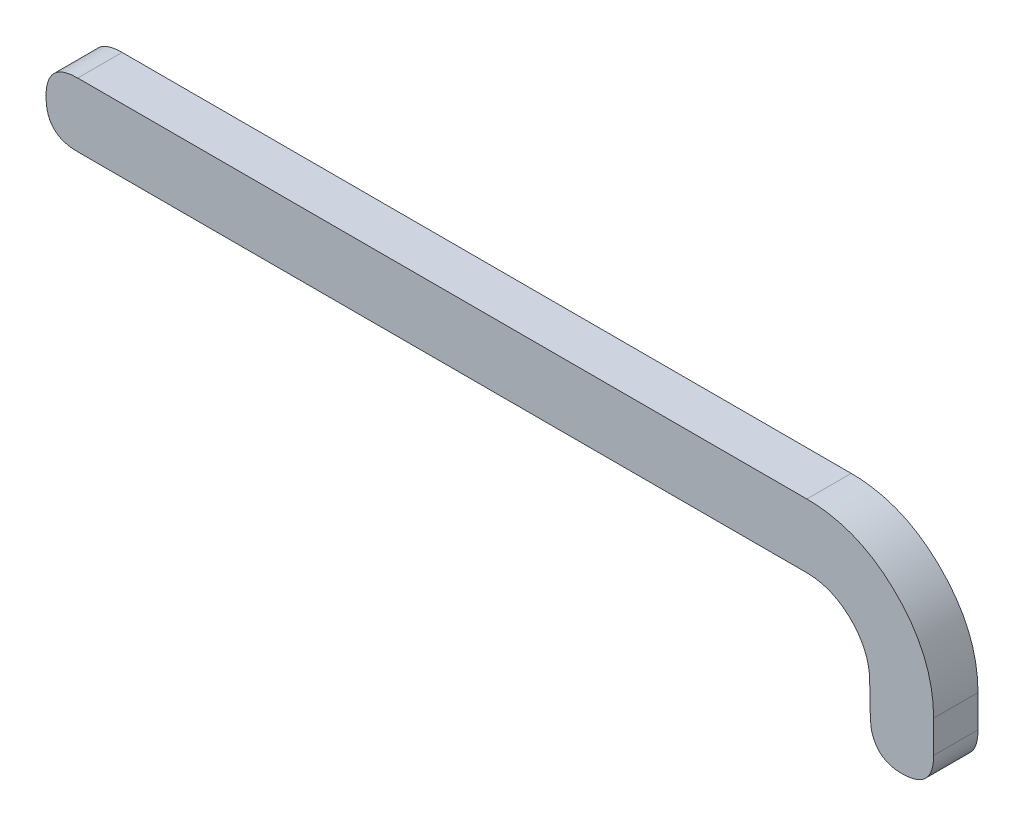
ISO-10303-21;
HEADER;
FILE_DESCRIPTION(('STEP AP214'),'2;1');
FILE_NAME('part.step','',(''),(''),'','','');
FILE_SCHEMA(('AUTOMOTIVE_DESIGN { 1 0 10303 214 1 1 1 1 }'));
ENDSEC;
DATA;
#1=APPLICATION_CONTEXT('core data for automotive mechanical design processes');
#2=APPLICATION_PROTOCOL_DEFINITION('international standard','automotive_design',2000,#1);
#3=PRODUCT_CONTEXT('',#1,'mechanical');
#4=PRODUCT('Part','Part','',(#3));
#5=PRODUCT_RELATED_PRODUCT_CATEGORY('part','',(#4));
#6=PRODUCT_DEFINITION_FORMATION('','',#4);
#7=PRODUCT_DEFINITION_CONTEXT('part definition',#1,'design');
#8=PRODUCT_DEFINITION('design','',#6,#7);
#9=PRODUCT_DEFINITION_SHAPE('','',#8);
#10=(LENGTH_UNIT() NAMED_UNIT(*) SI_UNIT(.MILLI.,.METRE.));
#11=(NAMED_UNIT(*) PLANE_ANGLE_UNIT() SI_UNIT($,.RADIAN.));
#12=(NAMED_UNIT(*) SI_UNIT($,.STERADIAN.) SOLID_ANGLE_UNIT());
#13=UNCERTAINTY_MEASURE_WITH_UNIT(LENGTH_MEASURE(1.E-05),#10,'distance_accuracy_value','');
#14=(GEOMETRIC_REPRESENTATION_CONTEXT(3) GLOBAL_UNCERTAINTY_ASSIGNED_CONTEXT((#13)) GLOBAL_UNIT_ASSIGNED_CONTEXT((#10,
#11,#12)) REPRESENTATION_CONTEXT('',''));
#15=CARTESIAN_POINT('',(0.,0.,0.));
#16=DIRECTION('',(0.,0.,1.));
#17=DIRECTION('',(1.,0.,0.));
#18=AXIS2_PLACEMENT_3D('',#15,#16,#17);
#19=CARTESIAN_POINT('',(0.8,12.2,-2.6));
#20=DIRECTION('',(0.,0.,1.));
#21=DIRECTION('',(1.,0.,0.));
#22=AXIS2_PLACEMENT_3D('',#19,#20,#21);
#23=PLANE('',#22);
#24=CARTESIAN_POINT('',(-0.514,13.7547,-2.6));
#25=CARTESIAN_POINT('',(-0.513992439523263,13.7469169621375,-2.6));
#26=CARTESIAN_POINT('',(-0.51396616421923,13.7391329724433,-2.6));
#27=CARTESIAN_POINT('',(-0.513813152747901,13.7235486256283,-2.6));
#28=CARTESIAN_POINT('',(-0.513686191015335,13.7157482710242,-2.6));
#29=CARTESIAN_POINT('',(-0.513372606171161,13.7040462405317,-2.6));
#30=CARTESIAN_POINT('',(-0.513247443569363,13.7001430031946,-2.6));
#31=CARTESIAN_POINT('',(-0.512935041754469,13.6923422883331,-2.6));
#32=CARTESIAN_POINT('',(-0.512747858309911,13.6884448087826,-2.6));
#33=CARTESIAN_POINT('',(-0.512267952269374,13.6806382697806,-2.6));
#34=CARTESIAN_POINT('',(-0.511974750614945,13.6767292389591,-2.6));
#35=CARTESIAN_POINT('',(-0.511374130056192,13.6708759084883,-2.6));
#36=CARTESIAN_POINT('',(-0.511146877771411,13.6689249690361,-2.6));
#37=CARTESIAN_POINT('',(-0.510551304272528,13.6650424898007,-2.6));
#38=CARTESIAN_POINT('',(-0.510182747122977,13.6631109880378,-2.6));
#39=CARTESIAN_POINT('',(-0.509700000000026,13.6612000000001,-2.6));
#40=B_SPLINE_CURVE_WITH_KNOTS('',3,(#24,#25,#26,#27,#28,#29,#30,#31,#32,#33,#34,#35,#36,#37,#38,
#39),.UNSPECIFIED.,.F.,.F.,(4,2,2,2,2,2,2,4),(0.,0.0233507180397154,0.0467538963865247,
0.0584693623887338,0.0701743224179198,0.0819328478246718,0.0878213898441195,0.093719807030956),.UNSPECIFIED.);
#41=CARTESIAN_POINT('',(-0.514,13.7547,-2.6));
#42=VERTEX_POINT('',#41);
#43=CARTESIAN_POINT('',(-0.5097,13.6612,-2.6));
#44=VERTEX_POINT('',#43);
#45=EDGE_CURVE('E102',#42,#44,#40,.T.);
#46=ORIENTED_EDGE('',*,*,#45,.T.);
#47=CARTESIAN_POINT('',(-0.5097,13.6612,-2.6));
#48=CARTESIAN_POINT('',(-0.4967,13.6116,-2.6));
#49=CARTESIAN_POINT('',(-0.442,13.6116,-2.6));
#50=B_SPLINE_CURVE_WITH_KNOTS('',2,(#47,#48,#49),.UNSPECIFIED.,.F.,.F.,(3,3),(0.,1.),.UNSPECIFIED.);
#51=CARTESIAN_POINT('',(-0.442,13.6116,-2.6));
#52=VERTEX_POINT('',#51);
#53=EDGE_CURVE('E98',#44,#52,#50,.T.);
#54=ORIENTED_EDGE('',*,*,#53,.T.);
#55=CARTESIAN_POINT('',(-0.442,13.6116,-2.6));
#56=CARTESIAN_POINT('',(-0.37,13.6116,-2.6));
#57=CARTESIAN_POINT('',(-0.37,13.68285,-2.6));
#58=B_SPLINE_CURVE_WITH_KNOTS('',2,(#55,#56,#57),.UNSPECIFIED.,.F.,.F.,(3,3),(0.,1.),.UNSPECIFIED.);
#59=CARTESIAN_POINT('',(-0.37,13.68285,-2.6));
#60=VERTEX_POINT('',#59);
#61=EDGE_CURVE('E99',#52,#60,#58,.T.);
#62=ORIENTED_EDGE('',*,*,#61,.T.);
#63=DIRECTION('',(0.,1.,0.));
#64=VECTOR('',#63,1.);
#65=CARTESIAN_POINT('',(-0.37,13.68285,-2.6));
#66=LINE('',#65,#64);
#67=CARTESIAN_POINT('',(-0.37,13.7555,-2.6));
#68=VERTEX_POINT('',#67);
#69=EDGE_CURVE('E105',#68,#60,#66,.F.);
#70=ORIENTED_EDGE('',*,*,#69,.F.);
#71=CARTESIAN_POINT('',(-0.37,13.7555,-2.6));
#72=CARTESIAN_POINT('',(-0.369999795267714,13.7639356762021,-2.6));
#73=CARTESIAN_POINT('',(-0.370330469413124,13.7723708236469,-2.6));
#74=CARTESIAN_POINT('',(-0.371705857625162,13.7891904213095,-2.6));
#75=CARTESIAN_POINT('',(-0.372751287600482,13.7975748121867,-2.6));
#76=CARTESIAN_POINT('',(-0.377008159383832,13.8223815031798,-2.6));
#77=CARTESIAN_POINT('',(-0.381338209248161,13.8386323433921,-2.6));
#78=CARTESIAN_POINT('',(-0.392745018796437,13.8692159419492,-2.6));
#79=CARTESIAN_POINT('',(-0.399675851214184,13.8836037632631,-2.6));
#80=CARTESIAN_POINT('',(-0.415960563189714,13.9109741457235,-2.6));
#81=CARTESIAN_POINT('',(-0.425320107720134,13.9239533194525,-2.6));
#82=CARTESIAN_POINT('',(-0.440611826555889,13.9420309208136,-2.6));
#83=CARTESIAN_POINT('',(-0.445833987205678,13.9477519515066,-2.6));
#84=CARTESIAN_POINT('',(-0.456654975596502,13.9588262863802,-2.6));
#85=CARTESIAN_POINT('',(-0.46225380843204,13.9641795855852,-2.6));
#86=CARTESIAN_POINT('',(-0.479601508912798,13.9795998041768,-2.6));
#87=CARTESIAN_POINT('',(-0.491918120332636,13.989046698378,-2.6));
#88=CARTESIAN_POINT('',(-0.519805585572607,14.0069457858733,-2.6));
#89=CARTESIAN_POINT('',(-0.535590432240039,14.0150701005733,-2.6));
#90=CARTESIAN_POINT('',(-0.568480235799122,14.0279675988792,-2.6));
#91=CARTESIAN_POINT('',(-0.585584948629732,14.0327414003998,-2.6));
#92=CARTESIAN_POINT('',(-0.611668823347793,14.0374066275645,-2.6));
#93=CARTESIAN_POINT('',(-0.620448306046699,14.0385456131214,-2.6));
#94=CARTESIAN_POINT('',(-0.638051903586573,14.0400414563127,-2.6));
#95=CARTESIAN_POINT('',(-0.646875846240952,14.0404003121177,-2.6));
#96=CARTESIAN_POINT('',(-0.6557,14.0404,-2.6));
#97=B_SPLINE_CURVE_WITH_KNOTS('',3,(#71,#72,#73,#74,#75,#76,#77,#78,#79,#80,#81,#82,#83,#84,#85,
#86,#87,#88,#89,#90,#91,#92,#93,#94,#95,#96),.UNSPECIFIED.,.F.,.F.,(4,2,2,2,2,2,2,2,2,2,2,2,4),
(0.,0.025296890959214,0.0506191568032763,0.100745903204657,0.148401553756057,0.196169376251188,
0.219392809161303,0.242616556232219,0.288987664188253,0.341894716109755,0.394792008141197,
0.421321737942619,0.447783435865917),.UNSPECIFIED.);
#98=CARTESIAN_POINT('',(-0.6557,14.0404,-2.6));
#99=VERTEX_POINT('',#98);
#100=EDGE_CURVE('E151',#68,#99,#97,.T.);
#101=ORIENTED_EDGE('',*,*,#100,.T.);
#102=DIRECTION('',(1.,0.,0.));
#103=VECTOR('',#102,1.);
#104=CARTESIAN_POINT('',(-0.6557,14.0404,-2.6));
#105=LINE('',#104,#103);
#106=CARTESIAN_POINT('',(-2.29855,14.0404,-2.6));
#107=VERTEX_POINT('',#106);
#108=EDGE_CURVE('E188',#107,#99,#105,.T.);
#109=ORIENTED_EDGE('',*,*,#108,.F.);
#110=CARTESIAN_POINT('',(-2.29855,14.0404,-2.6));
#111=CARTESIAN_POINT('',(-2.37,14.0404,-2.6));
#112=CARTESIAN_POINT('',(-2.37,13.9684,-2.6));
#113=B_SPLINE_CURVE_WITH_KNOTS('',2,(#110,#111,#112),.UNSPECIFIED.,.F.,.F.,(3,3),(0.,1.),.UNSPECIFIED.);
#114=CARTESIAN_POINT('',(-2.37,13.9684,-2.6));
#115=VERTEX_POINT('',#114);
#116=EDGE_CURVE('E121',#107,#115,#113,.T.);
#117=ORIENTED_EDGE('',*,*,#116,.T.);
#118=CARTESIAN_POINT('',(-2.37,13.9684,-2.6));
#119=CARTESIAN_POINT('',(-2.37,13.8964,-2.6));
#120=CARTESIAN_POINT('',(-2.2986,13.8964,-2.6));
#121=B_SPLINE_CURVE_WITH_KNOTS('',2,(#118,#119,#120),.UNSPECIFIED.,.F.,.F.,(3,3),(0.,1.),.UNSPECIFIED.);
#122=CARTESIAN_POINT('',(-2.2986,13.8964,-2.6));
#123=VERTEX_POINT('',#122);
#124=EDGE_CURVE('E145',#115,#123,#121,.T.);
#125=ORIENTED_EDGE('',*,*,#124,.T.);
#126=DIRECTION('',(1.,0.,0.));
#127=VECTOR('',#126,1.);
#128=CARTESIAN_POINT('',(-2.2986,13.8964,-2.6));
#129=LINE('',#128,#127);
#130=CARTESIAN_POINT('',(-0.65675,13.8964,-2.6));
#131=VERTEX_POINT('',#130);
#132=EDGE_CURVE('E119',#131,#123,#129,.F.);
#133=ORIENTED_EDGE('',*,*,#132,.F.);
#134=CARTESIAN_POINT('',(-0.65675,13.8964,-2.6));
#135=CARTESIAN_POINT('',(-0.648221575617804,13.8964338818946,-2.6));
#136=CARTESIAN_POINT('',(-0.639666216668702,13.8957376716407,-2.6));
#137=CARTESIAN_POINT('',(-0.622896651731456,13.8928395902493,-2.6));
#138=CARTESIAN_POINT('',(-0.614680085976263,13.8906511840929,-2.6));
#139=CARTESIAN_POINT('',(-0.599227091214523,13.8848779078032,-2.6));
#140=CARTESIAN_POINT('',(-0.591961998373963,13.8813705098438,-2.6));
#141=CARTESIAN_POINT('',(-0.578154157894008,13.8731274319291,-2.6));
#142=CARTESIAN_POINT('',(-0.571613226845041,13.8683887585657,-2.6));
#143=CARTESIAN_POINT('',(-0.559510981872766,13.8581430795934,-2.6));
#144=CARTESIAN_POINT('',(-0.5539261230247,13.8526634663834,-2.6));
#145=CARTESIAN_POINT('',(-0.543606257140364,13.8409588981983,-2.6));
#146=CARTESIAN_POINT('',(-0.538870212845675,13.8347348686376,-2.6));
#147=CARTESIAN_POINT('',(-0.530016793600627,13.8207464848942,-2.6));
#148=CARTESIAN_POINT('',(-0.526046654598121,13.8128868372863,-2.6));
#149=CARTESIAN_POINT('',(-0.519782833435996,13.7965247168791,-2.6));
#150=CARTESIAN_POINT('',(-0.517488821807033,13.7880223707752,-2.6));
#151=CARTESIAN_POINT('',(-0.515332480477766,13.7753112154684,-2.6));
#152=CARTESIAN_POINT('',(-0.514825773364434,13.7711993374472,-2.6));
#153=CARTESIAN_POINT('',(-0.514160052247634,13.7629584014488,-2.6));
#154=CARTESIAN_POINT('',(-0.514000096728838,13.7588294205697,-2.6));
#155=CARTESIAN_POINT('',(-0.514,13.7547,-2.6));
#156=B_SPLINE_CURVE_WITH_KNOTS('',3,(#134,#135,#136,#137,#138,#139,#140,#141,#142,#143,#144,
#145,#146,#147,#148,#149,#150,#151,#152,#153,#154,#155),.UNSPECIFIED.,.F.,.F.,(4,2,2,2,2,2,2,2,
2,2,4),(0.,0.0255938461274164,0.0509597476606635,0.0750232148244756,0.0991457402151181,
0.122542811574577,0.145911093622122,0.172146961715134,0.198377671344927,0.210794485370981,
0.223177542261578),.UNSPECIFIED.);
#157=EDGE_CURVE('E23',#131,#42,#156,.T.);
#158=ORIENTED_EDGE('',*,*,#157,.T.);
#159=EDGE_LOOP('',(#46,#54,#62,#70,#101,#109,#117,#125,#133,#158));
#160=FACE_BOUND('',#159,.T.);
#161=ADVANCED_FACE('F17',(#160),#23,.T.);
#162=CARTESIAN_POINT('',(-0.37,13.68285,-2.7));
#163=DIRECTION('',(1.,0.,0.));
#164=DIRECTION('',(0.,0.,-1.));
#165=AXIS2_PLACEMENT_3D('',#162,#163,#164);
#166=PLANE('',#165);
#167=DIRECTION('',(0.,1.,0.));
#168=VECTOR('',#167,1.);
#169=CARTESIAN_POINT('',(-0.37,12.2,-2.7));
#170=LINE('',#169,#168);
#171=CARTESIAN_POINT('',(-0.37,13.68285,-2.7));
#172=VERTEX_POINT('',#171);
#173=CARTESIAN_POINT('',(-0.37,13.7555,-2.7));
#174=VERTEX_POINT('',#173);
#175=EDGE_CURVE('E110',#172,#174,#170,.T.);
#176=ORIENTED_EDGE('',*,*,#175,.T.);
#177=DIRECTION('',(0.,0.,1.));
#178=VECTOR('',#177,1.);
#179=CARTESIAN_POINT('',(-0.37,13.7555,-2.65));
#180=LINE('',#179,#178);
#181=EDGE_CURVE('E262',#174,#68,#180,.T.);
#182=ORIENTED_EDGE('',*,*,#181,.T.);
#183=ORIENTED_EDGE('',*,*,#69,.T.);
#184=DIRECTION('',(0.,0.,-1.));
#185=VECTOR('',#184,1.);
#186=CARTESIAN_POINT('',(-0.37,13.68285,-2.65));
#187=LINE('',#186,#185);
#188=EDGE_CURVE('E111',#60,#172,#187,.T.);
#189=ORIENTED_EDGE('',*,*,#188,.T.);
#190=EDGE_LOOP('',(#176,#182,#183,#189));
#191=FACE_BOUND('',#190,.T.);
#192=ADVANCED_FACE('F133',(#191),#166,.T.);
#193=CARTESIAN_POINT('',(-0.37,13.7555,-2.7));
#194=CARTESIAN_POINT('',(-0.37,13.8723,-2.7));
#195=CARTESIAN_POINT('',(-0.53855,14.0404,-2.7));
#196=CARTESIAN_POINT('',(-0.6557,14.0404,-2.7));
#197=CARTESIAN_POINT('',(-0.37,13.7555,-2.6));
#198=CARTESIAN_POINT('',(-0.37,13.8723,-2.6));
#199=CARTESIAN_POINT('',(-0.53855,14.0404,-2.6));
#200=CARTESIAN_POINT('',(-0.6557,14.0404,-2.6));
#201=B_SPLINE_SURFACE_WITH_KNOTS('',1,2,((#193,#194,#195,#196),(#197,#198,#199,#200)),
.UNSPECIFIED.,.F.,.F.,.F.,(2,2),(3,1,3),(0.,1.),(0.,0.5,1.),.UNSPECIFIED.);
#202=CARTESIAN_POINT('',(-0.37,13.7555,-2.7));
#203=CARTESIAN_POINT('',(-0.369999795267714,13.7639356762021,-2.7));
#204=CARTESIAN_POINT('',(-0.370330469413124,13.7723708236469,-2.7));
#205=CARTESIAN_POINT('',(-0.371705857625162,13.7891904213095,-2.7));
#206=CARTESIAN_POINT('',(-0.372751287600482,13.7975748121867,-2.7));
#207=CARTESIAN_POINT('',(-0.377008159383832,13.8223815031798,-2.7));
#208=CARTESIAN_POINT('',(-0.381338209248161,13.8386323433921,-2.7));
#209=CARTESIAN_POINT('',(-0.392745018796436,13.8692159419492,-2.7));
#210=CARTESIAN_POINT('',(-0.399675851214183,13.8836037632631,-2.7));
#211=CARTESIAN_POINT('',(-0.415960563189713,13.9109741457235,-2.7));
#212=CARTESIAN_POINT('',(-0.425320107720133,13.9239533194525,-2.7));
#213=CARTESIAN_POINT('',(-0.440611826555889,13.9420309208136,-2.7));
#214=CARTESIAN_POINT('',(-0.445833987205678,13.9477519515066,-2.7));
#215=CARTESIAN_POINT('',(-0.456654975596502,13.9588262863802,-2.7));
#216=CARTESIAN_POINT('',(-0.46225380843204,13.9641795855852,-2.7));
#217=CARTESIAN_POINT('',(-0.479601508912798,13.9795998041768,-2.7));
#218=CARTESIAN_POINT('',(-0.491918120332636,13.989046698378,-2.7));
#219=CARTESIAN_POINT('',(-0.519805585572607,14.0069457858733,-2.7));
#220=CARTESIAN_POINT('',(-0.535590432240039,14.0150701005733,-2.7));
#221=CARTESIAN_POINT('',(-0.568480235799122,14.0279675988792,-2.7));
#222=CARTESIAN_POINT('',(-0.585584948629732,14.0327414003998,-2.7));
#223=CARTESIAN_POINT('',(-0.611668823347793,14.0374066275645,-2.7));
#224=CARTESIAN_POINT('',(-0.620448306046699,14.0385456131214,-2.7));
#225=CARTESIAN_POINT('',(-0.638051903586573,14.0400414563127,-2.7));
#226=CARTESIAN_POINT('',(-0.646875846240952,14.0404003121177,-2.7));
#227=CARTESIAN_POINT('',(-0.6557,14.0404,-2.7));
#228=B_SPLINE_CURVE_WITH_KNOTS('',3,(#202,#203,#204,#205,#206,#207,#208,#209,#210,#211,#212,
#213,#214,#215,#216,#217,#218,#219,#220,#221,#222,#223,#224,#225,#226,#227),.UNSPECIFIED.,.F.,
.F.,(4,2,2,2,2,2,2,2,2,2,2,2,4),(0.,0.025296890959214,0.0506191568032763,0.100745903204657,
0.148401553756057,0.196169376251188,0.219392809161304,0.242616556232219,0.288987664188253,
0.341894716109754,0.394792008141196,0.421321737942619,0.447783435865916),.UNSPECIFIED.);
#229=CARTESIAN_POINT('',(-0.6557,14.0404,-2.7));
#230=VERTEX_POINT('',#229);
#231=EDGE_CURVE('E236',#174,#230,#228,.T.);
#232=DIRECTION('',(0.,0.,1.));
#233=VECTOR('',#232,1.);
#234=CARTESIAN_POINT('',(-0.6557,14.0404,-2.7));
#235=LINE('',#234,#233);
#236=EDGE_CURVE('E260',#99,#230,#235,.F.);
#237=ORIENTED_EDGE('',*,*,#181,.F.);
#238=ORIENTED_EDGE('',*,*,#231,.T.);
#239=ORIENTED_EDGE('',*,*,#236,.F.);
#240=ORIENTED_EDGE('',*,*,#100,.F.);
#241=EDGE_LOOP('',(#237,#238,#239,#240));
#242=FACE_BOUND('',#241,.T.);
#243=ADVANCED_FACE('F135',(#242),#201,.F.);
#244=CARTESIAN_POINT('',(-0.6557,14.0404,-2.7));
#245=DIRECTION('',(0.,1.,0.));
#246=DIRECTION('',(0.,0.,1.));
#247=AXIS2_PLACEMENT_3D('',#244,#245,#246);
#248=PLANE('',#247);
#249=DIRECTION('',(1.,0.,0.));
#250=VECTOR('',#249,1.);
#251=CARTESIAN_POINT('',(0.8,14.0404,-2.7));
#252=LINE('',#251,#250);
#253=CARTESIAN_POINT('',(-2.29855,14.0404,-2.7));
#254=VERTEX_POINT('',#253);
#255=EDGE_CURVE('E231',#230,#254,#252,.F.);
#256=ORIENTED_EDGE('',*,*,#255,.T.);
#257=DIRECTION('',(0.,0.,1.));
#258=VECTOR('',#257,1.);
#259=CARTESIAN_POINT('',(-2.29855,14.0404,-2.65));
#260=LINE('',#259,#258);
#261=EDGE_CURVE('E258',#254,#107,#260,.T.);
#262=ORIENTED_EDGE('',*,*,#261,.T.);
#263=ORIENTED_EDGE('',*,*,#108,.T.);
#264=ORIENTED_EDGE('',*,*,#236,.T.);
#265=EDGE_LOOP('',(#256,#262,#263,#264));
#266=FACE_BOUND('',#265,.T.);
#267=ADVANCED_FACE('F270',(#266),#248,.T.);
#268=CARTESIAN_POINT('',(-2.29855,14.0404,-2.7));
#269=CARTESIAN_POINT('',(-2.37,14.0404,-2.7));
#270=CARTESIAN_POINT('',(-2.37,13.9684,-2.7));
#271=CARTESIAN_POINT('',(-2.29855,14.0404,-2.6));
#272=CARTESIAN_POINT('',(-2.37,14.0404,-2.6));
#273=CARTESIAN_POINT('',(-2.37,13.9684,-2.6));
#274=B_SPLINE_SURFACE_WITH_KNOTS('',1,2,((#268,#269,#270),(#271,#272,#273)),.UNSPECIFIED.,.F.,
.F.,.F.,(2,2),(3,3),(0.,1.),(0.,1.),.UNSPECIFIED.);
#275=CARTESIAN_POINT('',(-2.29855,14.0404,-2.7));
#276=CARTESIAN_POINT('',(-2.37,14.0404,-2.7));
#277=CARTESIAN_POINT('',(-2.37,13.9684,-2.7));
#278=B_SPLINE_CURVE_WITH_KNOTS('',2,(#275,#276,#277),.UNSPECIFIED.,.F.,.F.,(3,3),(0.,1.),.UNSPECIFIED.);
#279=CARTESIAN_POINT('',(-2.37,13.9684,-2.7));
#280=VERTEX_POINT('',#279);
#281=EDGE_CURVE('E206',#254,#280,#278,.T.);
#282=DIRECTION('',(0.,0.,1.));
#283=VECTOR('',#282,1.);
#284=CARTESIAN_POINT('',(-2.37,13.9684,-2.65));
#285=LINE('',#284,#283);
#286=EDGE_CURVE('E256',#280,#115,#285,.T.);
#287=ORIENTED_EDGE('',*,*,#261,.F.);
#288=ORIENTED_EDGE('',*,*,#281,.T.);
#289=ORIENTED_EDGE('',*,*,#286,.T.);
#290=ORIENTED_EDGE('',*,*,#116,.F.);
#291=EDGE_LOOP('',(#287,#288,#289,#290));
#292=FACE_BOUND('',#291,.T.);
#293=ADVANCED_FACE('F274',(#292),#274,.F.);
#294=CARTESIAN_POINT('',(-2.37,13.9684,-2.7));
#295=CARTESIAN_POINT('',(-2.37,13.8964,-2.7));
#296=CARTESIAN_POINT('',(-2.2986,13.8964,-2.7));
#297=CARTESIAN_POINT('',(-2.37,13.9684,-2.6));
#298=CARTESIAN_POINT('',(-2.37,13.8964,-2.6));
#299=CARTESIAN_POINT('',(-2.2986,13.8964,-2.6));
#300=B_SPLINE_SURFACE_WITH_KNOTS('',1,2,((#294,#295,#296),(#297,#298,#299)),.UNSPECIFIED.,.F.,
.F.,.F.,(2,2),(3,3),(0.,1.),(0.,1.),.UNSPECIFIED.);
#301=CARTESIAN_POINT('',(-2.37,13.9684,-2.7));
#302=CARTESIAN_POINT('',(-2.37,13.8964,-2.7));
#303=CARTESIAN_POINT('',(-2.2986,13.8964,-2.7));
#304=B_SPLINE_CURVE_WITH_KNOTS('',2,(#301,#302,#303),.UNSPECIFIED.,.F.,.F.,(3,3),(0.,1.),.UNSPECIFIED.);
#305=CARTESIAN_POINT('',(-2.2986,13.8964,-2.7));
#306=VERTEX_POINT('',#305);
#307=EDGE_CURVE('E210',#280,#306,#304,.T.);
#308=DIRECTION('',(0.,0.,-1.));
#309=VECTOR('',#308,1.);
#310=CARTESIAN_POINT('',(-2.2986,13.8964,-2.7));
#311=LINE('',#310,#309);
#312=EDGE_CURVE('E254',#123,#306,#311,.T.);
#313=ORIENTED_EDGE('',*,*,#286,.F.);
#314=ORIENTED_EDGE('',*,*,#307,.T.);
#315=ORIENTED_EDGE('',*,*,#312,.F.);
#316=ORIENTED_EDGE('',*,*,#124,.F.);
#317=EDGE_LOOP('',(#313,#314,#315,#316));
#318=FACE_BOUND('',#317,.T.);
#319=ADVANCED_FACE('F275',(#318),#300,.F.);
#320=CARTESIAN_POINT('',(-2.2986,13.8964,-2.7));
#321=DIRECTION('',(0.,-1.,0.));
#322=DIRECTION('',(0.,0.,-1.));
#323=AXIS2_PLACEMENT_3D('',#320,#321,#322);
#324=PLANE('',#323);
#325=DIRECTION('',(1.,0.,0.));
#326=VECTOR('',#325,1.);
#327=CARTESIAN_POINT('',(0.8,13.8964,-2.7));
#328=LINE('',#327,#326);
#329=CARTESIAN_POINT('',(-0.65675,13.8964,-2.7));
#330=VERTEX_POINT('',#329);
#331=EDGE_CURVE('E220',#306,#330,#328,.T.);
#332=ORIENTED_EDGE('',*,*,#331,.T.);
#333=DIRECTION('',(0.,0.,1.));
#334=VECTOR('',#333,1.);
#335=CARTESIAN_POINT('',(-0.65675,13.8964,-2.65));
#336=LINE('',#335,#334);
#337=EDGE_CURVE('E251',#330,#131,#336,.T.);
#338=ORIENTED_EDGE('',*,*,#337,.T.);
#339=ORIENTED_EDGE('',*,*,#132,.T.);
#340=ORIENTED_EDGE('',*,*,#312,.T.);
#341=EDGE_LOOP('',(#332,#338,#339,#340));
#342=FACE_BOUND('',#341,.T.);
#343=ADVANCED_FACE('F197',(#342),#324,.T.);
#344=CARTESIAN_POINT('',(-0.65675,13.8964,-2.7));
#345=CARTESIAN_POINT('',(-0.59825,13.8964,-2.7));
#346=CARTESIAN_POINT('',(-0.514,13.8128,-2.7));
#347=CARTESIAN_POINT('',(-0.514,13.7547,-2.7));
#348=CARTESIAN_POINT('',(-0.65675,13.8964,-2.6));
#349=CARTESIAN_POINT('',(-0.59825,13.8964,-2.6));
#350=CARTESIAN_POINT('',(-0.514,13.8128,-2.6));
#351=CARTESIAN_POINT('',(-0.514,13.7547,-2.6));
#352=B_SPLINE_SURFACE_WITH_KNOTS('',1,2,((#344,#345,#346,#347),(#348,#349,#350,#351)),
.UNSPECIFIED.,.F.,.F.,.F.,(2,2),(3,1,3),(0.,1.),(0.,0.5,1.),.UNSPECIFIED.);
#353=CARTESIAN_POINT('',(-0.65675,13.8964,-2.7));
#354=CARTESIAN_POINT('',(-0.648221575617804,13.8964338818946,-2.7));
#355=CARTESIAN_POINT('',(-0.639666216668702,13.8957376716407,-2.7));
#356=CARTESIAN_POINT('',(-0.622896651731455,13.8928395902493,-2.7));
#357=CARTESIAN_POINT('',(-0.614680085976262,13.8906511840929,-2.7));
#358=CARTESIAN_POINT('',(-0.599227091214523,13.8848779078032,-2.7));
#359=CARTESIAN_POINT('',(-0.591961998373964,13.8813705098438,-2.7));
#360=CARTESIAN_POINT('',(-0.578154157894009,13.8731274319291,-2.7));
#361=CARTESIAN_POINT('',(-0.571613226845041,13.8683887585657,-2.7));
#362=CARTESIAN_POINT('',(-0.559510981872766,13.8581430795934,-2.7));
#363=CARTESIAN_POINT('',(-0.5539261230247,13.8526634663834,-2.7));
#364=CARTESIAN_POINT('',(-0.543606257140364,13.8409588981983,-2.7));
#365=CARTESIAN_POINT('',(-0.538870212845674,13.8347348686376,-2.7));
#366=CARTESIAN_POINT('',(-0.530016793600626,13.8207464848942,-2.7));
#367=CARTESIAN_POINT('',(-0.526046654598121,13.8128868372863,-2.7));
#368=CARTESIAN_POINT('',(-0.519782833435996,13.7965247168791,-2.7));
#369=CARTESIAN_POINT('',(-0.517488821807034,13.7880223707752,-2.7));
#370=CARTESIAN_POINT('',(-0.515332480477766,13.7753112154684,-2.7));
#371=CARTESIAN_POINT('',(-0.514825773364434,13.7711993374472,-2.7));
#372=CARTESIAN_POINT('',(-0.514160052247634,13.7629584014488,-2.7));
#373=CARTESIAN_POINT('',(-0.514000096728838,13.7588294205697,-2.7));
#374=CARTESIAN_POINT('',(-0.514,13.7547,-2.7));
#375=B_SPLINE_CURVE_WITH_KNOTS('',3,(#353,#354,#355,#356,#357,#358,#359,#360,#361,#362,#363,
#364,#365,#366,#367,#368,#369,#370,#371,#372,#373,#374),.UNSPECIFIED.,.F.,.F.,(4,2,2,2,2,2,2,2,
2,2,4),(0.,0.0255938461274165,0.0509597476606635,0.0750232148244755,0.0991457402151177,
0.122542811574577,0.145911093622123,0.172146961715133,0.198377671344922,0.210794485370979,
0.223177542261579),.UNSPECIFIED.);
#376=CARTESIAN_POINT('',(-0.514,13.7547,-2.7));
#377=VERTEX_POINT('',#376);
#378=EDGE_CURVE('E187',#330,#377,#375,.T.);
#379=DIRECTION('',(0.,0.,1.));
#380=VECTOR('',#379,1.);
#381=CARTESIAN_POINT('',(-0.514,13.7547,-2.65));
#382=LINE('',#381,#380);
#383=EDGE_CURVE('E248',#377,#42,#382,.T.);
#384=ORIENTED_EDGE('',*,*,#337,.F.);
#385=ORIENTED_EDGE('',*,*,#378,.T.);
#386=ORIENTED_EDGE('',*,*,#383,.T.);
#387=ORIENTED_EDGE('',*,*,#157,.F.);
#388=EDGE_LOOP('',(#384,#385,#386,#387));
#389=FACE_BOUND('',#388,.T.);
#390=ADVANCED_FACE('F165',(#389),#352,.F.);
#391=CARTESIAN_POINT('',(-0.514,13.7547,-2.7));
#392=CARTESIAN_POINT('',(-0.514,13.6768,-2.7));
#393=CARTESIAN_POINT('',(-0.5097,13.6612,-2.7));
#394=CARTESIAN_POINT('',(-0.514,13.7547,-2.6));
#395=CARTESIAN_POINT('',(-0.514,13.6768,-2.6));
#396=CARTESIAN_POINT('',(-0.5097,13.6612,-2.6));
#397=B_SPLINE_SURFACE_WITH_KNOTS('',1,2,((#391,#392,#393),(#394,#395,#396)),.UNSPECIFIED.,.F.,
.F.,.F.,(2,2),(3,3),(0.,1.),(0.,1.),.UNSPECIFIED.);
#398=CARTESIAN_POINT('',(-0.514,13.7547,-2.7));
#399=CARTESIAN_POINT('',(-0.513992439523263,13.7469169621375,-2.7));
#400=CARTESIAN_POINT('',(-0.513966164219231,13.7391329724433,-2.7));
#401=CARTESIAN_POINT('',(-0.513813152747901,13.7235486256283,-2.7));
#402=CARTESIAN_POINT('',(-0.513686191015335,13.7157482710242,-2.7));
#403=CARTESIAN_POINT('',(-0.513372606171161,13.7040462405317,-2.7));
#404=CARTESIAN_POINT('',(-0.513247443569363,13.7001430031946,-2.7));
#405=CARTESIAN_POINT('',(-0.512935041754469,13.6923422883331,-2.7));
#406=CARTESIAN_POINT('',(-0.512747858309911,13.6884448087826,-2.7));
#407=CARTESIAN_POINT('',(-0.512267952269374,13.6806382697806,-2.7));
#408=CARTESIAN_POINT('',(-0.511974750614945,13.6767292389591,-2.7));
#409=CARTESIAN_POINT('',(-0.511374130056192,13.6708759084883,-2.7));
#410=CARTESIAN_POINT('',(-0.511146877771411,13.6689249690361,-2.7));
#411=CARTESIAN_POINT('',(-0.510551304272529,13.6650424898007,-2.7));
#412=CARTESIAN_POINT('',(-0.510182747122977,13.6631109880378,-2.7));
#413=CARTESIAN_POINT('',(-0.509700000000026,13.6612000000001,-2.7));
#414=B_SPLINE_CURVE_WITH_KNOTS('',3,(#398,#399,#400,#401,#402,#403,#404,#405,#406,#407,#408,
#409,#410,#411,#412,#413),.UNSPECIFIED.,.F.,.F.,(4,2,2,2,2,2,2,4),(0.,0.0233507180397154,
0.0467538963865247,0.0584693623887338,0.0701743224179198,0.0819328478246718,0.0878213898441195,
0.093719807030956),.UNSPECIFIED.);
#415=CARTESIAN_POINT('',(-0.5097,13.6612,-2.7));
#416=VERTEX_POINT('',#415);
#417=EDGE_CURVE('E180',#377,#416,#414,.T.);
#418=DIRECTION('',(0.,0.,1.));
#419=VECTOR('',#418,1.);
#420=CARTESIAN_POINT('',(-0.5097,13.6612,-2.65));
#421=LINE('',#420,#419);
#422=EDGE_CURVE('E245',#416,#44,#421,.T.);
#423=ORIENTED_EDGE('',*,*,#383,.F.);
#424=ORIENTED_EDGE('',*,*,#417,.T.);
#425=ORIENTED_EDGE('',*,*,#422,.T.);
#426=ORIENTED_EDGE('',*,*,#45,.F.);
#427=EDGE_LOOP('',(#423,#424,#425,#426));
#428=FACE_BOUND('',#427,.T.);
#429=ADVANCED_FACE('F160',(#428),#397,.F.);
#430=CARTESIAN_POINT('',(-0.5097,13.6612,-2.7));
#431=CARTESIAN_POINT('',(-0.4967,13.6116,-2.7));
#432=CARTESIAN_POINT('',(-0.442,13.6116,-2.7));
#433=CARTESIAN_POINT('',(-0.5097,13.6612,-2.6));
#434=CARTESIAN_POINT('',(-0.4967,13.6116,-2.6));
#435=CARTESIAN_POINT('',(-0.442,13.6116,-2.6));
#436=B_SPLINE_SURFACE_WITH_KNOTS('',1,2,((#430,#431,#432),(#433,#434,#435)),.UNSPECIFIED.,.F.,
.F.,.F.,(2,2),(3,3),(0.,1.),(0.,1.),.UNSPECIFIED.);
#437=CARTESIAN_POINT('',(-0.5097,13.6612,-2.7));
#438=CARTESIAN_POINT('',(-0.4967,13.6116,-2.7));
#439=CARTESIAN_POINT('',(-0.442,13.6116,-2.7));
#440=B_SPLINE_CURVE_WITH_KNOTS('',2,(#437,#438,#439),.UNSPECIFIED.,.F.,.F.,(3,3),(0.,1.),.UNSPECIFIED.);
#441=CARTESIAN_POINT('',(-0.442,13.6116,-2.7));
#442=VERTEX_POINT('',#441);
#443=EDGE_CURVE('E34',#416,#442,#440,.T.);
#444=DIRECTION('',(0.,0.,1.));
#445=VECTOR('',#444,1.);
#446=CARTESIAN_POINT('',(-0.442,13.6116,-2.65));
#447=LINE('',#446,#445);
#448=EDGE_CURVE('E42',#442,#52,#447,.T.);
#449=ORIENTED_EDGE('',*,*,#422,.F.);
#450=ORIENTED_EDGE('',*,*,#443,.T.);
#451=ORIENTED_EDGE('',*,*,#448,.T.);
#452=ORIENTED_EDGE('',*,*,#53,.F.);
#453=EDGE_LOOP('',(#449,#450,#451,#452));
#454=FACE_BOUND('',#453,.T.);
#455=ADVANCED_FACE('F108',(#454),#436,.F.);
#456=CARTESIAN_POINT('',(-0.442,13.6116,-2.7));
#457=CARTESIAN_POINT('',(-0.37,13.6116,-2.7));
#458=CARTESIAN_POINT('',(-0.37,13.68285,-2.7));
#459=CARTESIAN_POINT('',(-0.442,13.6116,-2.6));
#460=CARTESIAN_POINT('',(-0.37,13.6116,-2.6));
#461=CARTESIAN_POINT('',(-0.37,13.68285,-2.6));
#462=B_SPLINE_SURFACE_WITH_KNOTS('',1,2,((#456,#457,#458),(#459,#460,#461)),.UNSPECIFIED.,.F.,
.F.,.F.,(2,2),(3,3),(0.,1.),(0.,1.),.UNSPECIFIED.);
#463=CARTESIAN_POINT('',(-0.442,13.6116,-2.7));
#464=CARTESIAN_POINT('',(-0.37,13.6116,-2.7));
#465=CARTESIAN_POINT('',(-0.37,13.68285,-2.7));
#466=B_SPLINE_CURVE_WITH_KNOTS('',2,(#463,#464,#465),.UNSPECIFIED.,.F.,.F.,(3,3),(0.,1.),.UNSPECIFIED.);
#467=EDGE_CURVE('E11',#442,#172,#466,.T.);
#468=ORIENTED_EDGE('',*,*,#448,.F.);
#469=ORIENTED_EDGE('',*,*,#467,.T.);
#470=ORIENTED_EDGE('',*,*,#188,.F.);
#471=ORIENTED_EDGE('',*,*,#61,.F.);
#472=EDGE_LOOP('',(#468,#469,#470,#471));
#473=FACE_BOUND('',#472,.T.);
#474=ADVANCED_FACE('F19',(#473),#462,.F.);
#475=CARTESIAN_POINT('',(0.8,12.2,-2.7));
#476=DIRECTION('',(0.,0.,1.));
#477=DIRECTION('',(1.,0.,0.));
#478=AXIS2_PLACEMENT_3D('',#475,#476,#477);
#479=PLANE('',#478);
#480=ORIENTED_EDGE('',*,*,#443,.F.);
#481=ORIENTED_EDGE('',*,*,#417,.F.);
#482=ORIENTED_EDGE('',*,*,#378,.F.);
#483=ORIENTED_EDGE('',*,*,#331,.F.);
#484=ORIENTED_EDGE('',*,*,#307,.F.);
#485=ORIENTED_EDGE('',*,*,#281,.F.);
#486=ORIENTED_EDGE('',*,*,#255,.F.);
#487=ORIENTED_EDGE('',*,*,#231,.F.);
#488=ORIENTED_EDGE('',*,*,#175,.F.);
#489=ORIENTED_EDGE('',*,*,#467,.F.);
#490=EDGE_LOOP('',(#480,#481,#482,#483,#484,#485,#486,#487,#488,#489));
#491=FACE_BOUND('',#490,.T.);
#492=ADVANCED_FACE('F192',(#491),#479,.F.);
#493=CLOSED_SHELL('',(#161,#192,#243,#267,#293,#319,#343,#390,#429,#455,#474,#492));
#494=MANIFOLD_SOLID_BREP('B1',#493);
#495=ADVANCED_BREP_SHAPE_REPRESENTATION('',(#18,#494),#14);
#496=SHAPE_DEFINITION_REPRESENTATION(#9,#495);
ENDSEC;
END-ISO-10303-21;
